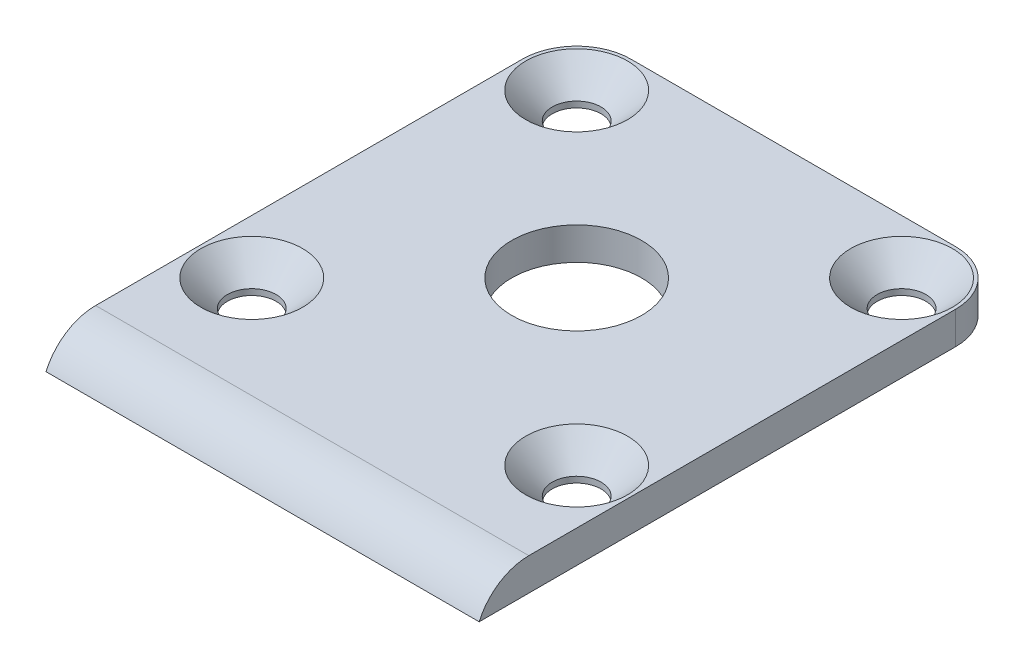
ISO-10303-21;
HEADER;
FILE_DESCRIPTION(('STEP AP214'),'2;1');
FILE_NAME('part.step','',(''),(''),'','','');
FILE_SCHEMA(('AUTOMOTIVE_DESIGN { 1 0 10303 214 1 1 1 1 }'));
ENDSEC;
DATA;
#1=APPLICATION_CONTEXT('core data for automotive mechanical design processes');
#2=APPLICATION_PROTOCOL_DEFINITION('international standard','automotive_design',2000,#1);
#3=PRODUCT_CONTEXT('',#1,'mechanical');
#4=PRODUCT('Part','Part','',(#3));
#5=PRODUCT_RELATED_PRODUCT_CATEGORY('part','',(#4));
#6=PRODUCT_DEFINITION_FORMATION('','',#4);
#7=PRODUCT_DEFINITION_CONTEXT('part definition',#1,'design');
#8=PRODUCT_DEFINITION('design','',#6,#7);
#9=PRODUCT_DEFINITION_SHAPE('','',#8);
#10=(LENGTH_UNIT() NAMED_UNIT(*) SI_UNIT(.MILLI.,.METRE.));
#11=(NAMED_UNIT(*) PLANE_ANGLE_UNIT() SI_UNIT($,.RADIAN.));
#12=(NAMED_UNIT(*) SI_UNIT($,.STERADIAN.) SOLID_ANGLE_UNIT());
#13=UNCERTAINTY_MEASURE_WITH_UNIT(LENGTH_MEASURE(1.E-05),#10,'distance_accuracy_value','');
#14=(GEOMETRIC_REPRESENTATION_CONTEXT(3) GLOBAL_UNCERTAINTY_ASSIGNED_CONTEXT((#13)) GLOBAL_UNIT_ASSIGNED_CONTEXT((#10,
#11,#12)) REPRESENTATION_CONTEXT('',''));
#15=CARTESIAN_POINT('',(0.,0.,0.));
#16=DIRECTION('',(0.,0.,1.));
#17=DIRECTION('',(1.,0.,0.));
#18=AXIS2_PLACEMENT_3D('',#15,#16,#17);
#19=CARTESIAN_POINT('',(40.,3.,0.));
#20=DIRECTION('',(-1.,0.,0.));
#21=DIRECTION('',(0.,0.,1.));
#22=AXIS2_PLACEMENT_3D('',#19,#20,#21);
#23=PLANE('',#22);
#24=DIRECTION('',(0.,0.,-1.));
#25=VECTOR('',#24,1.);
#26=CARTESIAN_POINT('',(40.,3.,0.));
#27=LINE('',#26,#25);
#28=CARTESIAN_POINT('',(40.,3.,-4.58257569495584));
#29=VERTEX_POINT('',#28);
#30=CARTESIAN_POINT('',(40.,3.,-44.));
#31=VERTEX_POINT('',#30);
#32=EDGE_CURVE('E95',#29,#31,#27,.T.);
#33=ORIENTED_EDGE('',*,*,#32,.F.);
#34=CARTESIAN_POINT('',(40.,-2.,-4.58257569495584));
#35=DIRECTION('',(-1.,0.,0.));
#36=DIRECTION('',(0.,0.,1.));
#37=AXIS2_PLACEMENT_3D('',#34,#35,#36);
#38=CIRCLE('',#37,5.);
#39=CARTESIAN_POINT('',(40.,0.,0.));
#40=VERTEX_POINT('',#39);
#41=EDGE_CURVE('E91',#29,#40,#38,.F.);
#42=ORIENTED_EDGE('',*,*,#41,.T.);
#43=DIRECTION('',(0.,0.,-1.));
#44=VECTOR('',#43,1.);
#45=CARTESIAN_POINT('',(40.,0.,0.));
#46=LINE('',#45,#44);
#47=CARTESIAN_POINT('',(40.,0.,-44.));
#48=VERTEX_POINT('',#47);
#49=EDGE_CURVE('E93',#40,#48,#46,.T.);
#50=ORIENTED_EDGE('',*,*,#49,.T.);
#51=DIRECTION('',(0.,-1.,0.));
#52=VECTOR('',#51,1.);
#53=CARTESIAN_POINT('',(40.,3.,-44.));
#54=LINE('',#53,#52);
#55=EDGE_CURVE('E101',#48,#31,#54,.F.);
#56=ORIENTED_EDGE('',*,*,#55,.T.);
#57=EDGE_LOOP('',(#33,#42,#50,#56));
#58=FACE_BOUND('',#57,.T.);
#59=ADVANCED_FACE('F37',(#58),#23,.F.);
#60=CARTESIAN_POINT('',(0.,3.,-49.));
#61=DIRECTION('',(0.,0.,-1.));
#62=DIRECTION('',(-1.,0.,0.));
#63=AXIS2_PLACEMENT_3D('',#60,#61,#62);
#64=PLANE('',#63);
#65=DIRECTION('',(1.,0.,0.));
#66=VECTOR('',#65,1.);
#67=CARTESIAN_POINT('',(0.,0.,-49.));
#68=LINE('',#67,#66);
#69=CARTESIAN_POINT('',(5.,0.,-49.));
#70=VERTEX_POINT('',#69);
#71=CARTESIAN_POINT('',(35.,0.,-49.));
#72=VERTEX_POINT('',#71);
#73=EDGE_CURVE('E106',#70,#72,#68,.T.);
#74=ORIENTED_EDGE('',*,*,#73,.F.);
#75=DIRECTION('',(0.,-1.,0.));
#76=VECTOR('',#75,1.);
#77=CARTESIAN_POINT('',(5.,3.,-49.));
#78=LINE('',#77,#76);
#79=CARTESIAN_POINT('',(5.,3.,-49.));
#80=VERTEX_POINT('',#79);
#81=EDGE_CURVE('E11',#70,#80,#78,.F.);
#82=ORIENTED_EDGE('',*,*,#81,.T.);
#83=DIRECTION('',(1.,0.,0.));
#84=VECTOR('',#83,1.);
#85=CARTESIAN_POINT('',(0.,3.,-49.));
#86=LINE('',#85,#84);
#87=CARTESIAN_POINT('',(35.,3.,-49.));
#88=VERTEX_POINT('',#87);
#89=EDGE_CURVE('E139',#80,#88,#86,.T.);
#90=ORIENTED_EDGE('',*,*,#89,.T.);
#91=DIRECTION('',(0.,-1.,0.));
#92=VECTOR('',#91,1.);
#93=CARTESIAN_POINT('',(35.,0.,-49.));
#94=LINE('',#93,#92);
#95=EDGE_CURVE('E45',#88,#72,#94,.T.);
#96=ORIENTED_EDGE('',*,*,#95,.T.);
#97=EDGE_LOOP('',(#74,#82,#90,#96));
#98=FACE_BOUND('',#97,.T.);
#99=ADVANCED_FACE('F136',(#98),#64,.T.);
#100=CARTESIAN_POINT('',(0.,3.,0.));
#101=DIRECTION('',(-1.,0.,0.));
#102=DIRECTION('',(0.,0.,1.));
#103=AXIS2_PLACEMENT_3D('',#100,#101,#102);
#104=PLANE('',#103);
#105=DIRECTION('',(0.,0.,-1.));
#106=VECTOR('',#105,1.);
#107=CARTESIAN_POINT('',(0.,0.,0.));
#108=LINE('',#107,#106);
#109=CARTESIAN_POINT('',(0.,0.,0.));
#110=VERTEX_POINT('',#109);
#111=CARTESIAN_POINT('',(0.,0.,-44.));
#112=VERTEX_POINT('',#111);
#113=EDGE_CURVE('E121',#110,#112,#108,.T.);
#114=ORIENTED_EDGE('',*,*,#113,.F.);
#115=CARTESIAN_POINT('',(0.,-2.,-4.58257569495584));
#116=DIRECTION('',(-1.,0.,0.));
#117=DIRECTION('',(0.,0.,1.));
#118=AXIS2_PLACEMENT_3D('',#115,#116,#117);
#119=CIRCLE('',#118,5.);
#120=CARTESIAN_POINT('',(0.,3.,-4.58257569495584));
#121=VERTEX_POINT('',#120);
#122=EDGE_CURVE('E110',#110,#121,#119,.T.);
#123=ORIENTED_EDGE('',*,*,#122,.T.);
#124=DIRECTION('',(0.,0.,-1.));
#125=VECTOR('',#124,1.);
#126=CARTESIAN_POINT('',(0.,3.,0.));
#127=LINE('',#126,#125);
#128=CARTESIAN_POINT('',(0.,3.,-44.));
#129=VERTEX_POINT('',#128);
#130=EDGE_CURVE('E117',#121,#129,#127,.T.);
#131=ORIENTED_EDGE('',*,*,#130,.T.);
#132=DIRECTION('',(0.,-1.,0.));
#133=VECTOR('',#132,1.);
#134=CARTESIAN_POINT('',(0.,3.,-44.));
#135=LINE('',#134,#133);
#136=EDGE_CURVE('E100',#129,#112,#135,.T.);
#137=ORIENTED_EDGE('',*,*,#136,.T.);
#138=EDGE_LOOP('',(#114,#123,#131,#137));
#139=FACE_BOUND('',#138,.T.);
#140=ADVANCED_FACE('F197',(#139),#104,.T.);
#141=CARTESIAN_POINT('',(0.,3.,0.));
#142=DIRECTION('',(0.,1.,0.));
#143=DIRECTION('',(0.,0.,1.));
#144=AXIS2_PLACEMENT_3D('',#141,#142,#143);
#145=PLANE('',#144);
#146=CARTESIAN_POINT('',(20.,3.,-29.));
#147=DIRECTION('',(0.,1.,0.));
#148=DIRECTION('',(0.,0.,1.));
#149=AXIS2_PLACEMENT_3D('',#146,#147,#148);
#150=CIRCLE('',#149,6.);
#151=CARTESIAN_POINT('',(20.,3.,-23.));
#152=VERTEX_POINT('',#151);
#153=EDGE_CURVE('E180',#152,#152,#150,.T.);
#154=ORIENTED_EDGE('',*,*,#153,.F.);
#155=EDGE_LOOP('',(#154));
#156=FACE_BOUND('',#155,.T.);
#157=CARTESIAN_POINT('',(5.,3.,-44.));
#158=DIRECTION('',(0.,1.,0.));
#159=DIRECTION('',(0.,0.,1.));
#160=AXIS2_PLACEMENT_3D('',#157,#158,#159);
#161=CIRCLE('',#160,4.7);
#162=CARTESIAN_POINT('',(5.,3.,-39.3));
#163=VERTEX_POINT('',#162);
#164=EDGE_CURVE('E176',#163,#163,#161,.T.);
#165=ORIENTED_EDGE('',*,*,#164,.F.);
#166=EDGE_LOOP('',(#165));
#167=FACE_BOUND('',#166,.T.);
#168=CARTESIAN_POINT('',(35.,3.,-44.));
#169=DIRECTION('',(0.,1.,0.));
#170=DIRECTION('',(0.,0.,1.));
#171=AXIS2_PLACEMENT_3D('',#168,#169,#170);
#172=CIRCLE('',#171,4.7);
#173=CARTESIAN_POINT('',(35.,3.,-39.3));
#174=VERTEX_POINT('',#173);
#175=EDGE_CURVE('E167',#174,#174,#172,.T.);
#176=ORIENTED_EDGE('',*,*,#175,.F.);
#177=EDGE_LOOP('',(#176));
#178=FACE_BOUND('',#177,.T.);
#179=CARTESIAN_POINT('',(35.,3.,-14.));
#180=DIRECTION('',(0.,1.,0.));
#181=DIRECTION('',(0.,0.,1.));
#182=AXIS2_PLACEMENT_3D('',#179,#180,#181);
#183=CIRCLE('',#182,4.7);
#184=CARTESIAN_POINT('',(35.,3.,-9.29999999999999));
#185=VERTEX_POINT('',#184);
#186=EDGE_CURVE('E158',#185,#185,#183,.T.);
#187=ORIENTED_EDGE('',*,*,#186,.F.);
#188=EDGE_LOOP('',(#187));
#189=FACE_BOUND('',#188,.T.);
#190=CARTESIAN_POINT('',(5.,3.,-14.));
#191=DIRECTION('',(0.,1.,0.));
#192=DIRECTION('',(0.,0.,1.));
#193=AXIS2_PLACEMENT_3D('',#190,#191,#192);
#194=CIRCLE('',#193,4.7);
#195=CARTESIAN_POINT('',(5.,3.,-9.29999999999999));
#196=VERTEX_POINT('',#195);
#197=EDGE_CURVE('E149',#196,#196,#194,.T.);
#198=ORIENTED_EDGE('',*,*,#197,.F.);
#199=EDGE_LOOP('',(#198));
#200=FACE_BOUND('',#199,.T.);
#201=ORIENTED_EDGE('',*,*,#130,.F.);
#202=DIRECTION('',(-1.,0.,0.));
#203=VECTOR('',#202,1.);
#204=CARTESIAN_POINT('',(40.,3.,-4.58257569495584));
#205=LINE('',#204,#203);
#206=EDGE_CURVE('E127',#121,#29,#205,.F.);
#207=ORIENTED_EDGE('',*,*,#206,.T.);
#208=ORIENTED_EDGE('',*,*,#32,.T.);
#209=CARTESIAN_POINT('',(35.,3.,-44.));
#210=DIRECTION('',(0.,1.,0.));
#211=DIRECTION('',(0.,0.,1.));
#212=AXIS2_PLACEMENT_3D('',#209,#210,#211);
#213=CIRCLE('',#212,5.);
#214=EDGE_CURVE('E123',#31,#88,#213,.T.);
#215=ORIENTED_EDGE('',*,*,#214,.T.);
#216=ORIENTED_EDGE('',*,*,#89,.F.);
#217=CARTESIAN_POINT('',(5.,3.,-44.));
#218=DIRECTION('',(0.,1.,0.));
#219=DIRECTION('',(0.,0.,1.));
#220=AXIS2_PLACEMENT_3D('',#217,#218,#219);
#221=CIRCLE('',#220,5.);
#222=EDGE_CURVE('E125',#80,#129,#221,.T.);
#223=ORIENTED_EDGE('',*,*,#222,.T.);
#224=EDGE_LOOP('',(#201,#207,#208,#215,#216,#223));
#225=FACE_BOUND('',#224,.T.);
#226=ADVANCED_FACE('F143',(#156,#167,#178,#189,#200,#225),#145,.T.);
#227=CARTESIAN_POINT('',(0.,0.,0.));
#228=DIRECTION('',(0.,1.,0.));
#229=DIRECTION('',(0.,0.,1.));
#230=AXIS2_PLACEMENT_3D('',#227,#228,#229);
#231=PLANE('',#230);
#232=CARTESIAN_POINT('',(20.,0.,-29.));
#233=DIRECTION('',(0.,1.,0.));
#234=DIRECTION('',(0.,0.,1.));
#235=AXIS2_PLACEMENT_3D('',#232,#233,#234);
#236=CIRCLE('',#235,6.);
#237=CARTESIAN_POINT('',(20.,0.,-23.));
#238=VERTEX_POINT('',#237);
#239=EDGE_CURVE('E179',#238,#238,#236,.T.);
#240=ORIENTED_EDGE('',*,*,#239,.T.);
#241=EDGE_LOOP('',(#240));
#242=FACE_BOUND('',#241,.T.);
#243=CARTESIAN_POINT('',(5.,0.,-44.));
#244=DIRECTION('',(0.,1.,0.));
#245=DIRECTION('',(0.,0.,1.));
#246=AXIS2_PLACEMENT_3D('',#243,#244,#245);
#247=CIRCLE('',#246,2.25);
#248=CARTESIAN_POINT('',(5.,0.,-41.75));
#249=VERTEX_POINT('',#248);
#250=EDGE_CURVE('E170',#249,#249,#247,.T.);
#251=ORIENTED_EDGE('',*,*,#250,.T.);
#252=EDGE_LOOP('',(#251));
#253=FACE_BOUND('',#252,.T.);
#254=CARTESIAN_POINT('',(35.,0.,-44.));
#255=DIRECTION('',(0.,1.,0.));
#256=DIRECTION('',(0.,0.,1.));
#257=AXIS2_PLACEMENT_3D('',#254,#255,#256);
#258=CIRCLE('',#257,2.25);
#259=CARTESIAN_POINT('',(35.,0.,-41.75));
#260=VERTEX_POINT('',#259);
#261=EDGE_CURVE('E161',#260,#260,#258,.T.);
#262=ORIENTED_EDGE('',*,*,#261,.T.);
#263=EDGE_LOOP('',(#262));
#264=FACE_BOUND('',#263,.T.);
#265=CARTESIAN_POINT('',(35.,0.,-14.));
#266=DIRECTION('',(0.,1.,0.));
#267=DIRECTION('',(0.,0.,1.));
#268=AXIS2_PLACEMENT_3D('',#265,#266,#267);
#269=CIRCLE('',#268,2.25);
#270=CARTESIAN_POINT('',(35.,0.,-11.75));
#271=VERTEX_POINT('',#270);
#272=EDGE_CURVE('E152',#271,#271,#269,.T.);
#273=ORIENTED_EDGE('',*,*,#272,.T.);
#274=EDGE_LOOP('',(#273));
#275=FACE_BOUND('',#274,.T.);
#276=CARTESIAN_POINT('',(5.,0.,-14.));
#277=DIRECTION('',(0.,1.,0.));
#278=DIRECTION('',(0.,0.,1.));
#279=AXIS2_PLACEMENT_3D('',#276,#277,#278);
#280=CIRCLE('',#279,2.25);
#281=CARTESIAN_POINT('',(5.,0.,-11.75));
#282=VERTEX_POINT('',#281);
#283=EDGE_CURVE('E111',#282,#282,#280,.T.);
#284=ORIENTED_EDGE('',*,*,#283,.T.);
#285=EDGE_LOOP('',(#284));
#286=FACE_BOUND('',#285,.T.);
#287=ORIENTED_EDGE('',*,*,#113,.T.);
#288=CARTESIAN_POINT('',(5.,0.,-44.));
#289=DIRECTION('',(0.,1.,0.));
#290=DIRECTION('',(0.,0.,1.));
#291=AXIS2_PLACEMENT_3D('',#288,#289,#290);
#292=CIRCLE('',#291,5.);
#293=EDGE_CURVE('E60',#112,#70,#292,.F.);
#294=ORIENTED_EDGE('',*,*,#293,.T.);
#295=ORIENTED_EDGE('',*,*,#73,.T.);
#296=CARTESIAN_POINT('',(35.,0.,-44.));
#297=DIRECTION('',(0.,1.,0.));
#298=DIRECTION('',(0.,0.,1.));
#299=AXIS2_PLACEMENT_3D('',#296,#297,#298);
#300=CIRCLE('',#299,5.);
#301=EDGE_CURVE('E52',#72,#48,#300,.F.);
#302=ORIENTED_EDGE('',*,*,#301,.T.);
#303=ORIENTED_EDGE('',*,*,#49,.F.);
#304=DIRECTION('',(1.,0.,0.));
#305=VECTOR('',#304,1.);
#306=CARTESIAN_POINT('',(0.,0.,0.));
#307=LINE('',#306,#305);
#308=EDGE_CURVE('E104',#110,#40,#307,.T.);
#309=ORIENTED_EDGE('',*,*,#308,.F.);
#310=EDGE_LOOP('',(#287,#294,#295,#302,#303,#309));
#311=FACE_BOUND('',#310,.T.);
#312=ADVANCED_FACE('F103',(#242,#253,#264,#275,#286,#311),#231,.F.);
#313=CARTESIAN_POINT('',(0.,-2.,-4.58257569495584));
#314=DIRECTION('',(1.,0.,0.));
#315=DIRECTION('',(0.,0.,-1.));
#316=AXIS2_PLACEMENT_3D('',#313,#314,#315);
#317=CYLINDRICAL_SURFACE('',#316,5.);
#318=ORIENTED_EDGE('',*,*,#122,.F.);
#319=ORIENTED_EDGE('',*,*,#308,.T.);
#320=ORIENTED_EDGE('',*,*,#41,.F.);
#321=ORIENTED_EDGE('',*,*,#206,.F.);
#322=EDGE_LOOP('',(#318,#319,#320,#321));
#323=FACE_BOUND('',#322,.T.);
#324=ADVANCED_FACE('F109',(#323),#317,.T.);
#325=CARTESIAN_POINT('',(5.,3.,-44.));
#326=DIRECTION('',(0.,-1.,0.));
#327=DIRECTION('',(0.,0.,-1.));
#328=AXIS2_PLACEMENT_3D('',#325,#326,#327);
#329=CYLINDRICAL_SURFACE('',#328,5.);
#330=ORIENTED_EDGE('',*,*,#222,.F.);
#331=ORIENTED_EDGE('',*,*,#81,.F.);
#332=ORIENTED_EDGE('',*,*,#293,.F.);
#333=ORIENTED_EDGE('',*,*,#136,.F.);
#334=EDGE_LOOP('',(#330,#331,#332,#333));
#335=FACE_BOUND('',#334,.T.);
#336=ADVANCED_FACE('F232',(#335),#329,.T.);
#337=CARTESIAN_POINT('',(35.,3.,-44.));
#338=DIRECTION('',(0.,1.,0.));
#339=DIRECTION('',(0.,0.,1.));
#340=AXIS2_PLACEMENT_3D('',#337,#338,#339);
#341=CYLINDRICAL_SURFACE('',#340,5.);
#342=ORIENTED_EDGE('',*,*,#214,.F.);
#343=ORIENTED_EDGE('',*,*,#55,.F.);
#344=ORIENTED_EDGE('',*,*,#301,.F.);
#345=ORIENTED_EDGE('',*,*,#95,.F.);
#346=EDGE_LOOP('',(#342,#343,#344,#345));
#347=FACE_BOUND('',#346,.T.);
#348=ADVANCED_FACE('F39',(#347),#341,.T.);
#349=CARTESIAN_POINT('',(5.,3.,-14.));
#350=DIRECTION('',(0.,1.,0.));
#351=DIRECTION('',(0.,0.,1.));
#352=AXIS2_PLACEMENT_3D('',#349,#350,#351);
#353=CYLINDRICAL_SURFACE('',#352,2.25);
#354=ORIENTED_EDGE('',*,*,#283,.F.);
#355=EDGE_LOOP('',(#354));
#356=FACE_BOUND('',#355,.T.);
#357=CARTESIAN_POINT('',(5.,0.550000000000001,-14.));
#358=DIRECTION('',(0.,1.,0.));
#359=DIRECTION('',(0.,0.,1.));
#360=AXIS2_PLACEMENT_3D('',#357,#358,#359);
#361=CIRCLE('',#360,2.25);
#362=CARTESIAN_POINT('',(5.,0.550000000000001,-11.75));
#363=VERTEX_POINT('',#362);
#364=EDGE_CURVE('E114',#363,#363,#361,.T.);
#365=ORIENTED_EDGE('',*,*,#364,.T.);
#366=EDGE_LOOP('',(#365));
#367=FACE_BOUND('',#366,.T.);
#368=ADVANCED_FACE('F210',(#356,#367),#353,.F.);
#369=CARTESIAN_POINT('',(5.,3.,-14.));
#370=DIRECTION('',(0.,1.,0.));
#371=DIRECTION('',(0.,0.,1.));
#372=AXIS2_PLACEMENT_3D('',#369,#370,#371);
#373=CONICAL_SURFACE('',#372,4.7,0.785398163397449);
#374=ORIENTED_EDGE('',*,*,#364,.F.);
#375=EDGE_LOOP('',(#374));
#376=FACE_BOUND('',#375,.T.);
#377=ORIENTED_EDGE('',*,*,#197,.T.);
#378=EDGE_LOOP('',(#377));
#379=FACE_BOUND('',#378,.T.);
#380=ADVANCED_FACE('F207',(#376,#379),#373,.F.);
#381=CARTESIAN_POINT('',(35.,3.,-14.));
#382=DIRECTION('',(0.,1.,0.));
#383=DIRECTION('',(0.,0.,1.));
#384=AXIS2_PLACEMENT_3D('',#381,#382,#383);
#385=CYLINDRICAL_SURFACE('',#384,2.25);
#386=ORIENTED_EDGE('',*,*,#272,.F.);
#387=EDGE_LOOP('',(#386));
#388=FACE_BOUND('',#387,.T.);
#389=CARTESIAN_POINT('',(35.,0.550000000000001,-14.));
#390=DIRECTION('',(0.,1.,0.));
#391=DIRECTION('',(0.,0.,1.));
#392=AXIS2_PLACEMENT_3D('',#389,#390,#391);
#393=CIRCLE('',#392,2.25);
#394=CARTESIAN_POINT('',(35.,0.550000000000001,-11.75));
#395=VERTEX_POINT('',#394);
#396=EDGE_CURVE('E155',#395,#395,#393,.T.);
#397=ORIENTED_EDGE('',*,*,#396,.T.);
#398=EDGE_LOOP('',(#397));
#399=FACE_BOUND('',#398,.T.);
#400=ADVANCED_FACE('F209',(#388,#399),#385,.F.);
#401=CARTESIAN_POINT('',(35.,3.,-14.));
#402=DIRECTION('',(0.,1.,0.));
#403=DIRECTION('',(0.,0.,1.));
#404=AXIS2_PLACEMENT_3D('',#401,#402,#403);
#405=CONICAL_SURFACE('',#404,4.7,0.785398163397449);
#406=ORIENTED_EDGE('',*,*,#396,.F.);
#407=EDGE_LOOP('',(#406));
#408=FACE_BOUND('',#407,.T.);
#409=ORIENTED_EDGE('',*,*,#186,.T.);
#410=EDGE_LOOP('',(#409));
#411=FACE_BOUND('',#410,.T.);
#412=ADVANCED_FACE('F217',(#408,#411),#405,.F.);
#413=CARTESIAN_POINT('',(35.,3.,-44.));
#414=DIRECTION('',(0.,1.,0.));
#415=DIRECTION('',(0.,0.,1.));
#416=AXIS2_PLACEMENT_3D('',#413,#414,#415);
#417=CYLINDRICAL_SURFACE('',#416,2.25);
#418=ORIENTED_EDGE('',*,*,#261,.F.);
#419=EDGE_LOOP('',(#418));
#420=FACE_BOUND('',#419,.T.);
#421=CARTESIAN_POINT('',(35.,0.550000000000001,-44.));
#422=DIRECTION('',(0.,1.,0.));
#423=DIRECTION('',(0.,0.,1.));
#424=AXIS2_PLACEMENT_3D('',#421,#422,#423);
#425=CIRCLE('',#424,2.25);
#426=CARTESIAN_POINT('',(35.,0.550000000000001,-41.75));
#427=VERTEX_POINT('',#426);
#428=EDGE_CURVE('E164',#427,#427,#425,.T.);
#429=ORIENTED_EDGE('',*,*,#428,.T.);
#430=EDGE_LOOP('',(#429));
#431=FACE_BOUND('',#430,.T.);
#432=ADVANCED_FACE('F299',(#420,#431),#417,.F.);
#433=CARTESIAN_POINT('',(35.,3.,-44.));
#434=DIRECTION('',(0.,1.,0.));
#435=DIRECTION('',(0.,0.,1.));
#436=AXIS2_PLACEMENT_3D('',#433,#434,#435);
#437=CONICAL_SURFACE('',#436,4.7,0.785398163397449);
#438=ORIENTED_EDGE('',*,*,#428,.F.);
#439=EDGE_LOOP('',(#438));
#440=FACE_BOUND('',#439,.T.);
#441=ORIENTED_EDGE('',*,*,#175,.T.);
#442=EDGE_LOOP('',(#441));
#443=FACE_BOUND('',#442,.T.);
#444=ADVANCED_FACE('F310',(#440,#443),#437,.F.);
#445=CARTESIAN_POINT('',(5.,3.,-44.));
#446=DIRECTION('',(0.,1.,0.));
#447=DIRECTION('',(0.,0.,1.));
#448=AXIS2_PLACEMENT_3D('',#445,#446,#447);
#449=CYLINDRICAL_SURFACE('',#448,2.25);
#450=ORIENTED_EDGE('',*,*,#250,.F.);
#451=EDGE_LOOP('',(#450));
#452=FACE_BOUND('',#451,.T.);
#453=CARTESIAN_POINT('',(5.,0.550000000000001,-44.));
#454=DIRECTION('',(0.,1.,0.));
#455=DIRECTION('',(0.,0.,1.));
#456=AXIS2_PLACEMENT_3D('',#453,#454,#455);
#457=CIRCLE('',#456,2.25);
#458=CARTESIAN_POINT('',(5.,0.550000000000001,-41.75));
#459=VERTEX_POINT('',#458);
#460=EDGE_CURVE('E173',#459,#459,#457,.T.);
#461=ORIENTED_EDGE('',*,*,#460,.T.);
#462=EDGE_LOOP('',(#461));
#463=FACE_BOUND('',#462,.T.);
#464=ADVANCED_FACE('F321',(#452,#463),#449,.F.);
#465=CARTESIAN_POINT('',(5.,3.,-44.));
#466=DIRECTION('',(0.,1.,0.));
#467=DIRECTION('',(0.,0.,1.));
#468=AXIS2_PLACEMENT_3D('',#465,#466,#467);
#469=CONICAL_SURFACE('',#468,4.7,0.785398163397449);
#470=ORIENTED_EDGE('',*,*,#460,.F.);
#471=EDGE_LOOP('',(#470));
#472=FACE_BOUND('',#471,.T.);
#473=ORIENTED_EDGE('',*,*,#164,.T.);
#474=EDGE_LOOP('',(#473));
#475=FACE_BOUND('',#474,.T.);
#476=ADVANCED_FACE('F191',(#472,#475),#469,.F.);
#477=CARTESIAN_POINT('',(20.,0.,-29.));
#478=DIRECTION('',(0.,1.,0.));
#479=DIRECTION('',(0.,0.,1.));
#480=AXIS2_PLACEMENT_3D('',#477,#478,#479);
#481=CYLINDRICAL_SURFACE('',#480,6.);
#482=ORIENTED_EDGE('',*,*,#239,.F.);
#483=EDGE_LOOP('',(#482));
#484=FACE_BOUND('',#483,.T.);
#485=ORIENTED_EDGE('',*,*,#153,.T.);
#486=EDGE_LOOP('',(#485));
#487=FACE_BOUND('',#486,.T.);
#488=ADVANCED_FACE('F188',(#484,#487),#481,.F.);
#489=CLOSED_SHELL('',(#59,#99,#140,#226,#312,#324,#336,#348,#368,#380,#400,#412,#432,#444,#464,
#476,#488));
#490=MANIFOLD_SOLID_BREP('B2',#489);
#491=ADVANCED_BREP_SHAPE_REPRESENTATION('',(#18,#490),#14);
#492=SHAPE_DEFINITION_REPRESENTATION(#9,#491);
ENDSEC;
END-ISO-10303-21;
